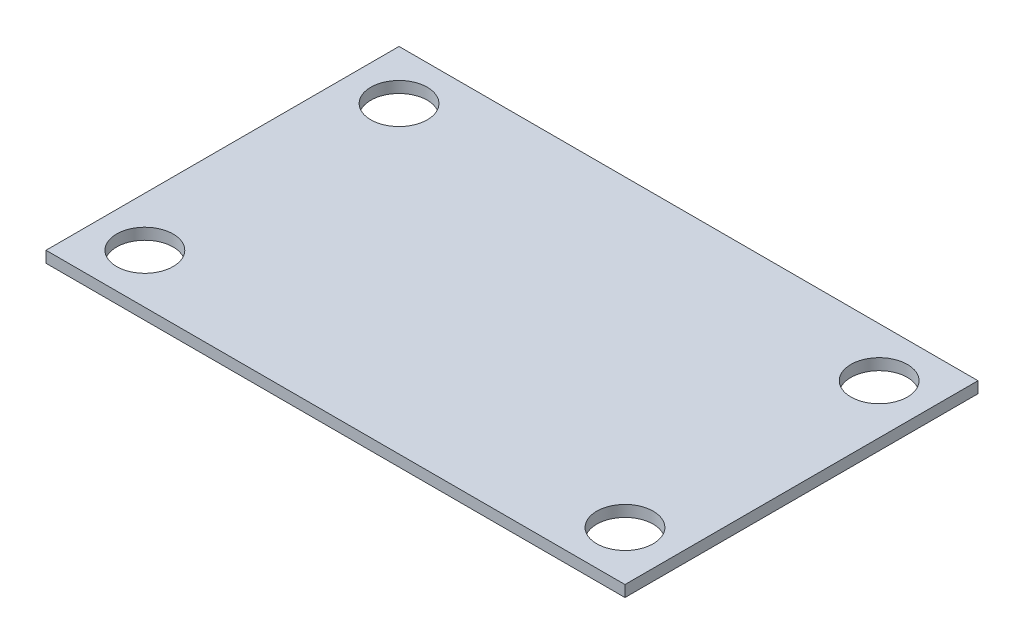
ISO-10303-21;
HEADER;
FILE_DESCRIPTION(('STEP AP214'),'2;1');
FILE_NAME('part.step','',(''),(''),'','','');
FILE_SCHEMA(('AUTOMOTIVE_DESIGN { 1 0 10303 214 1 1 1 1 }'));
ENDSEC;
DATA;
#1=APPLICATION_CONTEXT('core data for automotive mechanical design processes');
#2=APPLICATION_PROTOCOL_DEFINITION('international standard','automotive_design',2000,#1);
#3=PRODUCT_CONTEXT('',#1,'mechanical');
#4=PRODUCT('Part','Part','',(#3));
#5=PRODUCT_RELATED_PRODUCT_CATEGORY('part','',(#4));
#6=PRODUCT_DEFINITION_FORMATION('','',#4);
#7=PRODUCT_DEFINITION_CONTEXT('part definition',#1,'design');
#8=PRODUCT_DEFINITION('design','',#6,#7);
#9=PRODUCT_DEFINITION_SHAPE('','',#8);
#10=(LENGTH_UNIT() NAMED_UNIT(*) SI_UNIT(.MILLI.,.METRE.));
#11=(NAMED_UNIT(*) PLANE_ANGLE_UNIT() SI_UNIT($,.RADIAN.));
#12=(NAMED_UNIT(*) SI_UNIT($,.STERADIAN.) SOLID_ANGLE_UNIT());
#13=UNCERTAINTY_MEASURE_WITH_UNIT(LENGTH_MEASURE(1.E-05),#10,'distance_accuracy_value','');
#14=(GEOMETRIC_REPRESENTATION_CONTEXT(3) GLOBAL_UNCERTAINTY_ASSIGNED_CONTEXT((#13)) GLOBAL_UNIT_ASSIGNED_CONTEXT((#10,
#11,#12)) REPRESENTATION_CONTEXT('',''));
#15=CARTESIAN_POINT('',(0.,0.,0.));
#16=DIRECTION('',(0.,0.,1.));
#17=DIRECTION('',(1.,0.,0.));
#18=AXIS2_PLACEMENT_3D('',#15,#16,#17);
#19=CARTESIAN_POINT('',(0.,1.6,0.));
#20=DIRECTION('',(0.,1.,0.));
#21=DIRECTION('',(0.,0.,1.));
#22=AXIS2_PLACEMENT_3D('',#19,#20,#21);
#23=PLANE('',#22);
#24=CARTESIAN_POINT('',(-34.,1.6,18.));
#25=DIRECTION('',(0.,1.,0.));
#26=DIRECTION('',(0.,0.,1.));
#27=AXIS2_PLACEMENT_3D('',#24,#25,#26);
#28=CIRCLE('',#27,4.);
#29=CARTESIAN_POINT('',(-34.,1.6,22.));
#30=VERTEX_POINT('',#29);
#31=EDGE_CURVE('E122',#30,#30,#28,.T.);
#32=ORIENTED_EDGE('',*,*,#31,.F.);
#33=EDGE_LOOP('',(#32));
#34=FACE_BOUND('',#33,.T.);
#35=CARTESIAN_POINT('',(34.,1.6,18.));
#36=DIRECTION('',(0.,1.,0.));
#37=DIRECTION('',(0.,0.,-1.));
#38=AXIS2_PLACEMENT_3D('',#35,#36,#37);
#39=CIRCLE('',#38,4.);
#40=CARTESIAN_POINT('',(34.,1.6,14.));
#41=VERTEX_POINT('',#40);
#42=EDGE_CURVE('E101',#41,#41,#39,.T.);
#43=ORIENTED_EDGE('',*,*,#42,.F.);
#44=EDGE_LOOP('',(#43));
#45=FACE_BOUND('',#44,.T.);
#46=DIRECTION('',(0.,0.,-1.));
#47=VECTOR('',#46,1.);
#48=CARTESIAN_POINT('',(41.,1.6,-25.));
#49=LINE('',#48,#47);
#50=CARTESIAN_POINT('',(41.,1.6,25.));
#51=VERTEX_POINT('',#50);
#52=CARTESIAN_POINT('',(41.,1.6,-25.));
#53=VERTEX_POINT('',#52);
#54=EDGE_CURVE('E86',#51,#53,#49,.T.);
#55=ORIENTED_EDGE('',*,*,#54,.T.);
#56=DIRECTION('',(-1.,0.,0.));
#57=VECTOR('',#56,1.);
#58=CARTESIAN_POINT('',(-41.,1.6,-25.));
#59=LINE('',#58,#57);
#60=CARTESIAN_POINT('',(-41.,1.6,-25.));
#61=VERTEX_POINT('',#60);
#62=EDGE_CURVE('E81',#53,#61,#59,.T.);
#63=ORIENTED_EDGE('',*,*,#62,.T.);
#64=DIRECTION('',(0.,0.,1.));
#65=VECTOR('',#64,1.);
#66=CARTESIAN_POINT('',(-41.,1.6,-25.));
#67=LINE('',#66,#65);
#68=CARTESIAN_POINT('',(-41.,1.6,25.));
#69=VERTEX_POINT('',#68);
#70=EDGE_CURVE('E84',#61,#69,#67,.T.);
#71=ORIENTED_EDGE('',*,*,#70,.T.);
#72=DIRECTION('',(1.,0.,0.));
#73=VECTOR('',#72,1.);
#74=CARTESIAN_POINT('',(-41.,1.6,25.));
#75=LINE('',#74,#73);
#76=EDGE_CURVE('E51',#69,#51,#75,.T.);
#77=ORIENTED_EDGE('',*,*,#76,.T.);
#78=EDGE_LOOP('',(#55,#63,#71,#77));
#79=FACE_BOUND('',#78,.T.);
#80=CARTESIAN_POINT('',(34.,1.6,-18.));
#81=DIRECTION('',(0.,1.,0.));
#82=DIRECTION('',(0.,0.,1.));
#83=AXIS2_PLACEMENT_3D('',#80,#81,#82);
#84=CIRCLE('',#83,4.);
#85=CARTESIAN_POINT('',(34.,1.6,-14.));
#86=VERTEX_POINT('',#85);
#87=EDGE_CURVE('E116',#86,#86,#84,.T.);
#88=ORIENTED_EDGE('',*,*,#87,.F.);
#89=EDGE_LOOP('',(#88));
#90=FACE_BOUND('',#89,.T.);
#91=CARTESIAN_POINT('',(-34.,1.6,-18.));
#92=DIRECTION('',(0.,1.,0.));
#93=DIRECTION('',(0.,0.,-1.));
#94=AXIS2_PLACEMENT_3D('',#91,#92,#93);
#95=CIRCLE('',#94,4.);
#96=CARTESIAN_POINT('',(-34.,1.6,-22.));
#97=VERTEX_POINT('',#96);
#98=EDGE_CURVE('E128',#97,#97,#95,.T.);
#99=ORIENTED_EDGE('',*,*,#98,.F.);
#100=EDGE_LOOP('',(#99));
#101=FACE_BOUND('',#100,.T.);
#102=ADVANCED_FACE('F34',(#34,#45,#79,#90,#101),#23,.T.);
#103=CARTESIAN_POINT('',(0.,0.,0.));
#104=DIRECTION('',(0.,1.,0.));
#105=DIRECTION('',(0.,0.,1.));
#106=AXIS2_PLACEMENT_3D('',#103,#104,#105);
#107=PLANE('',#106);
#108=DIRECTION('',(0.,0.,-1.));
#109=VECTOR('',#108,1.);
#110=CARTESIAN_POINT('',(41.,0.,-25.));
#111=LINE('',#110,#109);
#112=CARTESIAN_POINT('',(41.,0.,25.));
#113=VERTEX_POINT('',#112);
#114=CARTESIAN_POINT('',(41.,0.,-25.));
#115=VERTEX_POINT('',#114);
#116=EDGE_CURVE('E98',#113,#115,#111,.T.);
#117=ORIENTED_EDGE('',*,*,#116,.F.);
#118=DIRECTION('',(1.,0.,0.));
#119=VECTOR('',#118,1.);
#120=CARTESIAN_POINT('',(-41.,0.,25.));
#121=LINE('',#120,#119);
#122=CARTESIAN_POINT('',(-41.,0.,25.));
#123=VERTEX_POINT('',#122);
#124=EDGE_CURVE('E74',#123,#113,#121,.T.);
#125=ORIENTED_EDGE('',*,*,#124,.F.);
#126=DIRECTION('',(0.,0.,1.));
#127=VECTOR('',#126,1.);
#128=CARTESIAN_POINT('',(-41.,0.,-25.));
#129=LINE('',#128,#127);
#130=CARTESIAN_POINT('',(-41.,0.,-25.));
#131=VERTEX_POINT('',#130);
#132=EDGE_CURVE('E68',#131,#123,#129,.T.);
#133=ORIENTED_EDGE('',*,*,#132,.F.);
#134=DIRECTION('',(-1.,0.,0.));
#135=VECTOR('',#134,1.);
#136=CARTESIAN_POINT('',(-41.,0.,-25.));
#137=LINE('',#136,#135);
#138=EDGE_CURVE('E90',#115,#131,#137,.T.);
#139=ORIENTED_EDGE('',*,*,#138,.F.);
#140=EDGE_LOOP('',(#117,#125,#133,#139));
#141=FACE_BOUND('',#140,.T.);
#142=CARTESIAN_POINT('',(34.,0.,18.));
#143=DIRECTION('',(0.,1.,0.));
#144=DIRECTION('',(0.,0.,-1.));
#145=AXIS2_PLACEMENT_3D('',#142,#143,#144);
#146=CIRCLE('',#145,4.);
#147=CARTESIAN_POINT('',(34.,0.,14.));
#148=VERTEX_POINT('',#147);
#149=EDGE_CURVE('E113',#148,#148,#146,.T.);
#150=ORIENTED_EDGE('',*,*,#149,.T.);
#151=EDGE_LOOP('',(#150));
#152=FACE_BOUND('',#151,.T.);
#153=CARTESIAN_POINT('',(34.,0.,-18.));
#154=DIRECTION('',(0.,1.,0.));
#155=DIRECTION('',(0.,0.,1.));
#156=AXIS2_PLACEMENT_3D('',#153,#154,#155);
#157=CIRCLE('',#156,4.);
#158=CARTESIAN_POINT('',(34.,0.,-14.));
#159=VERTEX_POINT('',#158);
#160=EDGE_CURVE('E119',#159,#159,#157,.T.);
#161=ORIENTED_EDGE('',*,*,#160,.T.);
#162=EDGE_LOOP('',(#161));
#163=FACE_BOUND('',#162,.T.);
#164=CARTESIAN_POINT('',(-34.,0.,18.));
#165=DIRECTION('',(0.,1.,0.));
#166=DIRECTION('',(0.,0.,1.));
#167=AXIS2_PLACEMENT_3D('',#164,#165,#166);
#168=CIRCLE('',#167,4.);
#169=CARTESIAN_POINT('',(-34.,0.,22.));
#170=VERTEX_POINT('',#169);
#171=EDGE_CURVE('E125',#170,#170,#168,.T.);
#172=ORIENTED_EDGE('',*,*,#171,.T.);
#173=EDGE_LOOP('',(#172));
#174=FACE_BOUND('',#173,.T.);
#175=CARTESIAN_POINT('',(-34.,0.,-18.));
#176=DIRECTION('',(0.,1.,0.));
#177=DIRECTION('',(0.,0.,-1.));
#178=AXIS2_PLACEMENT_3D('',#175,#176,#177);
#179=CIRCLE('',#178,4.);
#180=CARTESIAN_POINT('',(-34.,0.,-22.));
#181=VERTEX_POINT('',#180);
#182=EDGE_CURVE('E131',#181,#181,#179,.T.);
#183=ORIENTED_EDGE('',*,*,#182,.T.);
#184=EDGE_LOOP('',(#183));
#185=FACE_BOUND('',#184,.T.);
#186=ADVANCED_FACE('F109',(#141,#152,#163,#174,#185),#107,.F.);
#187=CARTESIAN_POINT('',(41.,1.6,-25.));
#188=DIRECTION('',(-1.,0.,0.));
#189=DIRECTION('',(0.,0.,1.));
#190=AXIS2_PLACEMENT_3D('',#187,#188,#189);
#191=PLANE('',#190);
#192=ORIENTED_EDGE('',*,*,#116,.T.);
#193=DIRECTION('',(0.,-1.,0.));
#194=VECTOR('',#193,1.);
#195=CARTESIAN_POINT('',(41.,1.6,-25.));
#196=LINE('',#195,#194);
#197=EDGE_CURVE('E11',#53,#115,#196,.T.);
#198=ORIENTED_EDGE('',*,*,#197,.F.);
#199=ORIENTED_EDGE('',*,*,#54,.F.);
#200=DIRECTION('',(0.,-1.,0.));
#201=VECTOR('',#200,1.);
#202=CARTESIAN_POINT('',(41.,1.6,25.));
#203=LINE('',#202,#201);
#204=EDGE_CURVE('E94',#51,#113,#203,.T.);
#205=ORIENTED_EDGE('',*,*,#204,.T.);
#206=EDGE_LOOP('',(#192,#198,#199,#205));
#207=FACE_BOUND('',#206,.T.);
#208=ADVANCED_FACE('F36',(#207),#191,.F.);
#209=CARTESIAN_POINT('',(-41.,1.6,-25.));
#210=DIRECTION('',(0.,0.,1.));
#211=DIRECTION('',(1.,0.,0.));
#212=AXIS2_PLACEMENT_3D('',#209,#210,#211);
#213=PLANE('',#212);
#214=ORIENTED_EDGE('',*,*,#138,.T.);
#215=DIRECTION('',(0.,-1.,0.));
#216=VECTOR('',#215,1.);
#217=CARTESIAN_POINT('',(-41.,1.6,-25.));
#218=LINE('',#217,#216);
#219=EDGE_CURVE('E43',#61,#131,#218,.T.);
#220=ORIENTED_EDGE('',*,*,#219,.F.);
#221=ORIENTED_EDGE('',*,*,#62,.F.);
#222=ORIENTED_EDGE('',*,*,#197,.T.);
#223=EDGE_LOOP('',(#214,#220,#221,#222));
#224=FACE_BOUND('',#223,.T.);
#225=ADVANCED_FACE('F89',(#224),#213,.F.);
#226=CARTESIAN_POINT('',(-41.,1.6,-25.));
#227=DIRECTION('',(1.,0.,0.));
#228=DIRECTION('',(0.,0.,-1.));
#229=AXIS2_PLACEMENT_3D('',#226,#227,#228);
#230=PLANE('',#229);
#231=ORIENTED_EDGE('',*,*,#132,.T.);
#232=DIRECTION('',(0.,-1.,0.));
#233=VECTOR('',#232,1.);
#234=CARTESIAN_POINT('',(-41.,1.6,25.));
#235=LINE('',#234,#233);
#236=EDGE_CURVE('E91',#69,#123,#235,.T.);
#237=ORIENTED_EDGE('',*,*,#236,.F.);
#238=ORIENTED_EDGE('',*,*,#70,.F.);
#239=ORIENTED_EDGE('',*,*,#219,.T.);
#240=EDGE_LOOP('',(#231,#237,#238,#239));
#241=FACE_BOUND('',#240,.T.);
#242=ADVANCED_FACE('F92',(#241),#230,.F.);
#243=CARTESIAN_POINT('',(-41.,1.6,25.));
#244=DIRECTION('',(0.,0.,-1.));
#245=DIRECTION('',(-1.,0.,0.));
#246=AXIS2_PLACEMENT_3D('',#243,#244,#245);
#247=PLANE('',#246);
#248=ORIENTED_EDGE('',*,*,#124,.T.);
#249=ORIENTED_EDGE('',*,*,#204,.F.);
#250=ORIENTED_EDGE('',*,*,#76,.F.);
#251=ORIENTED_EDGE('',*,*,#236,.T.);
#252=EDGE_LOOP('',(#248,#249,#250,#251));
#253=FACE_BOUND('',#252,.T.);
#254=ADVANCED_FACE('F106',(#253),#247,.F.);
#255=CARTESIAN_POINT('',(34.,1.6,18.));
#256=DIRECTION('',(0.,-1.,0.));
#257=DIRECTION('',(0.,0.,-1.));
#258=AXIS2_PLACEMENT_3D('',#255,#256,#257);
#259=CYLINDRICAL_SURFACE('',#258,4.);
#260=ORIENTED_EDGE('',*,*,#42,.T.);
#261=EDGE_LOOP('',(#260));
#262=FACE_BOUND('',#261,.T.);
#263=ORIENTED_EDGE('',*,*,#149,.F.);
#264=EDGE_LOOP('',(#263));
#265=FACE_BOUND('',#264,.T.);
#266=ADVANCED_FACE('F150',(#262,#265),#259,.F.);
#267=CARTESIAN_POINT('',(34.,1.6,-18.));
#268=DIRECTION('',(0.,-1.,0.));
#269=DIRECTION('',(0.,0.,-1.));
#270=AXIS2_PLACEMENT_3D('',#267,#268,#269);
#271=CYLINDRICAL_SURFACE('',#270,4.);
#272=ORIENTED_EDGE('',*,*,#87,.T.);
#273=EDGE_LOOP('',(#272));
#274=FACE_BOUND('',#273,.T.);
#275=ORIENTED_EDGE('',*,*,#160,.F.);
#276=EDGE_LOOP('',(#275));
#277=FACE_BOUND('',#276,.T.);
#278=ADVANCED_FACE('F196',(#274,#277),#271,.F.);
#279=CARTESIAN_POINT('',(-34.,1.6,18.));
#280=DIRECTION('',(0.,-1.,0.));
#281=DIRECTION('',(0.,0.,-1.));
#282=AXIS2_PLACEMENT_3D('',#279,#280,#281);
#283=CYLINDRICAL_SURFACE('',#282,4.);
#284=ORIENTED_EDGE('',*,*,#31,.T.);
#285=EDGE_LOOP('',(#284));
#286=FACE_BOUND('',#285,.T.);
#287=ORIENTED_EDGE('',*,*,#171,.F.);
#288=EDGE_LOOP('',(#287));
#289=FACE_BOUND('',#288,.T.);
#290=ADVANCED_FACE('F204',(#286,#289),#283,.F.);
#291=CARTESIAN_POINT('',(-34.,1.6,-18.));
#292=DIRECTION('',(0.,-1.,0.));
#293=DIRECTION('',(0.,0.,-1.));
#294=AXIS2_PLACEMENT_3D('',#291,#292,#293);
#295=CYLINDRICAL_SURFACE('',#294,4.);
#296=ORIENTED_EDGE('',*,*,#98,.T.);
#297=EDGE_LOOP('',(#296));
#298=FACE_BOUND('',#297,.T.);
#299=ORIENTED_EDGE('',*,*,#182,.F.);
#300=EDGE_LOOP('',(#299));
#301=FACE_BOUND('',#300,.T.);
#302=ADVANCED_FACE('F137',(#298,#301),#295,.F.);
#303=CLOSED_SHELL('',(#102,#186,#208,#225,#242,#254,#266,#278,#290,#302));
#304=MANIFOLD_SOLID_BREP('B2',#303);
#305=ADVANCED_BREP_SHAPE_REPRESENTATION('',(#18,#304),#14);
#306=SHAPE_DEFINITION_REPRESENTATION(#9,#305);
ENDSEC;
END-ISO-10303-21;
